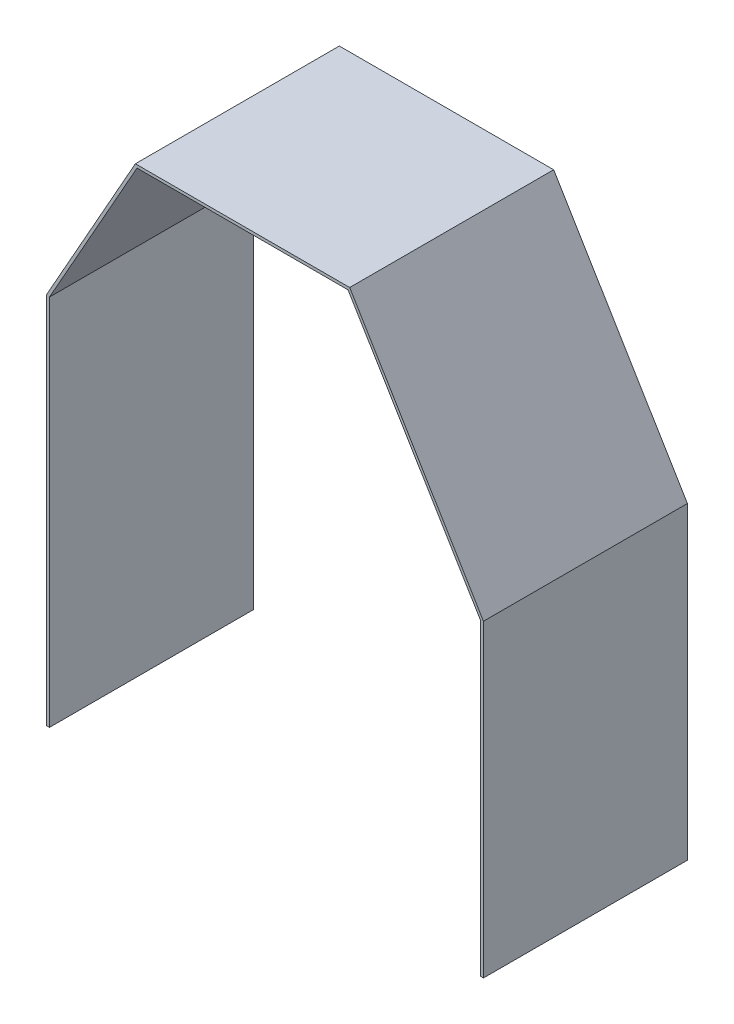
ISO-10303-21;
HEADER;
FILE_DESCRIPTION(('STEP AP214'),'2;1');
FILE_NAME('part.step','',(''),(''),'','','');
FILE_SCHEMA(('AUTOMOTIVE_DESIGN { 1 0 10303 214 1 1 1 1 }'));
ENDSEC;
DATA;
#1=APPLICATION_CONTEXT('core data for automotive mechanical design processes');
#2=APPLICATION_PROTOCOL_DEFINITION('international standard','automotive_design',2000,#1);
#3=PRODUCT_CONTEXT('',#1,'mechanical');
#4=PRODUCT('Part','Part','',(#3));
#5=PRODUCT_RELATED_PRODUCT_CATEGORY('part','',(#4));
#6=PRODUCT_DEFINITION_FORMATION('','',#4);
#7=PRODUCT_DEFINITION_CONTEXT('part definition',#1,'design');
#8=PRODUCT_DEFINITION('design','',#6,#7);
#9=PRODUCT_DEFINITION_SHAPE('','',#8);
#10=(LENGTH_UNIT() NAMED_UNIT(*) SI_UNIT(.MILLI.,.METRE.));
#11=(NAMED_UNIT(*) PLANE_ANGLE_UNIT() SI_UNIT($,.RADIAN.));
#12=(NAMED_UNIT(*) SI_UNIT($,.STERADIAN.) SOLID_ANGLE_UNIT());
#13=UNCERTAINTY_MEASURE_WITH_UNIT(LENGTH_MEASURE(1.E-05),#10,'distance_accuracy_value','');
#14=(GEOMETRIC_REPRESENTATION_CONTEXT(3) GLOBAL_UNCERTAINTY_ASSIGNED_CONTEXT((#13)) GLOBAL_UNIT_ASSIGNED_CONTEXT((#10,
#11,#12)) REPRESENTATION_CONTEXT('',''));
#15=CARTESIAN_POINT('',(0.,0.,0.));
#16=DIRECTION('',(0.,0.,1.));
#17=DIRECTION('',(1.,0.,0.));
#18=AXIS2_PLACEMENT_3D('',#15,#16,#17);
#19=CARTESIAN_POINT('',(-2.00000730477111,3.80536977384502E-06,-142.));
#20=DIRECTION('',(-1.,0.,0.));
#21=DIRECTION('',(0.,0.,1.));
#22=AXIS2_PLACEMENT_3D('',#19,#20,#21);
#23=PLANE('',#22);
#24=DIRECTION('',(0.,-1.,0.));
#25=VECTOR('',#24,1.);
#26=CARTESIAN_POINT('',(-2.00000730477111,3.80536977384502E-06,0.));
#27=LINE('',#26,#25);
#28=CARTESIAN_POINT('',(-2.00000730477111,260.000004065528,0.));
#29=VERTEX_POINT('',#28);
#30=CARTESIAN_POINT('',(-2.00000730477111,3.80536977384502E-06,0.));
#31=VERTEX_POINT('',#30);
#32=EDGE_CURVE('E151',#29,#31,#27,.T.);
#33=ORIENTED_EDGE('',*,*,#32,.F.);
#34=DIRECTION('',(0.,0.,1.));
#35=VECTOR('',#34,1.);
#36=CARTESIAN_POINT('',(-2.00000730477111,260.000004065528,-142.));
#37=LINE('',#36,#35);
#38=CARTESIAN_POINT('',(-2.00000730477111,260.000004065528,-142.));
#39=VERTEX_POINT('',#38);
#40=EDGE_CURVE('E11',#39,#29,#37,.T.);
#41=ORIENTED_EDGE('',*,*,#40,.F.);
#42=DIRECTION('',(0.,-1.,0.));
#43=VECTOR('',#42,1.);
#44=CARTESIAN_POINT('',(-2.00000730477111,3.80536977384502E-06,-142.));
#45=LINE('',#44,#43);
#46=CARTESIAN_POINT('',(-2.00000730477111,3.80536977384502E-06,-142.));
#47=VERTEX_POINT('',#46);
#48=EDGE_CURVE('E177',#39,#47,#45,.T.);
#49=ORIENTED_EDGE('',*,*,#48,.T.);
#50=DIRECTION('',(0.,0.,1.));
#51=VECTOR('',#50,1.);
#52=CARTESIAN_POINT('',(-2.00000730477111,3.80536977384502E-06,-142.));
#53=LINE('',#52,#51);
#54=EDGE_CURVE('E34',#47,#31,#53,.T.);
#55=ORIENTED_EDGE('',*,*,#54,.T.);
#56=EDGE_LOOP('',(#33,#41,#49,#55));
#57=FACE_BOUND('',#56,.T.);
#58=ADVANCED_FACE('F31',(#57),#23,.T.);
#59=CARTESIAN_POINT('',(59.8074747113915,369.746927632464,-142.));
#60=DIRECTION('',(-0.871321534689895,0.490712526012578,0.));
#61=DIRECTION('',(-0.490712526012578,-0.871321534689896,0.));
#62=AXIS2_PLACEMENT_3D('',#59,#60,#61);
#63=PLANE('',#62);
#64=DIRECTION('',(-0.490712526012578,-0.871321534689896,0.));
#65=VECTOR('',#64,1.);
#66=CARTESIAN_POINT('',(59.8074747113915,369.746927632464,0.));
#67=LINE('',#66,#65);
#68=CARTESIAN_POINT('',(59.8074747113915,369.746927632464,0.));
#69=VERTEX_POINT('',#68);
#70=EDGE_CURVE('E175',#69,#29,#67,.T.);
#71=ORIENTED_EDGE('',*,*,#70,.F.);
#72=DIRECTION('',(0.,0.,1.));
#73=VECTOR('',#72,1.);
#74=CARTESIAN_POINT('',(59.8074747113915,369.746927632464,-142.));
#75=LINE('',#74,#73);
#76=CARTESIAN_POINT('',(59.8074747113915,369.746927632464,-142.));
#77=VERTEX_POINT('',#76);
#78=EDGE_CURVE('E40',#77,#69,#75,.T.);
#79=ORIENTED_EDGE('',*,*,#78,.F.);
#80=DIRECTION('',(-0.490712526012578,-0.871321534689896,0.));
#81=VECTOR('',#80,1.);
#82=CARTESIAN_POINT('',(59.8074747113915,369.746927632464,-142.));
#83=LINE('',#82,#81);
#84=EDGE_CURVE('E141',#77,#39,#83,.T.);
#85=ORIENTED_EDGE('',*,*,#84,.T.);
#86=ORIENTED_EDGE('',*,*,#40,.T.);
#87=EDGE_LOOP('',(#71,#79,#85,#86));
#88=FACE_BOUND('',#87,.T.);
#89=ADVANCED_FACE('F206',(#88),#63,.T.);
#90=CARTESIAN_POINT('',(59.8074747113915,369.746927632464,-142.));
#91=DIRECTION('',(0.,1.,0.));
#92=DIRECTION('',(0.,0.,1.));
#93=AXIS2_PLACEMENT_3D('',#90,#91,#92);
#94=PLANE('',#93);
#95=DIRECTION('',(-1.,0.,0.));
#96=VECTOR('',#95,1.);
#97=CARTESIAN_POINT('',(59.8074747113915,369.746927632464,0.));
#98=LINE('',#97,#96);
#99=CARTESIAN_POINT('',(209.012375889982,369.746927632464,0.));
#100=VERTEX_POINT('',#99);
#101=EDGE_CURVE('E129',#100,#69,#98,.T.);
#102=ORIENTED_EDGE('',*,*,#101,.F.);
#103=DIRECTION('',(0.,0.,1.));
#104=VECTOR('',#103,1.);
#105=CARTESIAN_POINT('',(209.012375889982,369.746927632464,-142.));
#106=LINE('',#105,#104);
#107=CARTESIAN_POINT('',(209.012375889982,369.746927632464,-142.));
#108=VERTEX_POINT('',#107);
#109=EDGE_CURVE('E124',#108,#100,#106,.T.);
#110=ORIENTED_EDGE('',*,*,#109,.F.);
#111=DIRECTION('',(-1.,0.,0.));
#112=VECTOR('',#111,1.);
#113=CARTESIAN_POINT('',(59.8074747113915,369.746927632464,-142.));
#114=LINE('',#113,#112);
#115=EDGE_CURVE('E127',#108,#77,#114,.T.);
#116=ORIENTED_EDGE('',*,*,#115,.T.);
#117=ORIENTED_EDGE('',*,*,#78,.T.);
#118=EDGE_LOOP('',(#102,#110,#116,#117));
#119=FACE_BOUND('',#118,.T.);
#120=ADVANCED_FACE('F126',(#119),#94,.T.);
#121=CARTESIAN_POINT('',(209.012375889982,369.746927632464,-142.));
#122=DIRECTION('',(0.856694806511872,0.515823621498265,0.));
#123=DIRECTION('',(-0.515823621498265,0.856694806511873,0.));
#124=AXIS2_PLACEMENT_3D('',#121,#122,#123);
#125=PLANE('',#124);
#126=DIRECTION('',(-0.515823621498265,0.856694806511872,0.));
#127=VECTOR('',#126,1.);
#128=CARTESIAN_POINT('',(209.012375889982,369.746927632464,0.));
#129=LINE('',#128,#127);
#130=CARTESIAN_POINT('',(302.134985909321,215.08620050121,0.));
#131=VERTEX_POINT('',#130);
#132=EDGE_CURVE('E172',#131,#100,#129,.T.);
#133=ORIENTED_EDGE('',*,*,#132,.F.);
#134=DIRECTION('',(0.,0.,1.));
#135=VECTOR('',#134,1.);
#136=CARTESIAN_POINT('',(302.134985909321,215.08620050121,-142.));
#137=LINE('',#136,#135);
#138=CARTESIAN_POINT('',(302.134985909321,215.08620050121,-142.));
#139=VERTEX_POINT('',#138);
#140=EDGE_CURVE('E134',#139,#131,#137,.T.);
#141=ORIENTED_EDGE('',*,*,#140,.F.);
#142=DIRECTION('',(-0.515823621498265,0.856694806511872,0.));
#143=VECTOR('',#142,1.);
#144=CARTESIAN_POINT('',(209.012375889982,369.746927632464,-142.));
#145=LINE('',#144,#143);
#146=EDGE_CURVE('E139',#139,#108,#145,.T.);
#147=ORIENTED_EDGE('',*,*,#146,.T.);
#148=ORIENTED_EDGE('',*,*,#109,.T.);
#149=EDGE_LOOP('',(#133,#141,#147,#148));
#150=FACE_BOUND('',#149,.T.);
#151=ADVANCED_FACE('F143',(#150),#125,.T.);
#152=CARTESIAN_POINT('',(302.134985909321,-3.31530499667748E-07,-142.));
#153=DIRECTION('',(1.,0.,0.));
#154=DIRECTION('',(0.,0.,-1.));
#155=AXIS2_PLACEMENT_3D('',#152,#153,#154);
#156=PLANE('',#155);
#157=DIRECTION('',(0.,1.,0.));
#158=VECTOR('',#157,1.);
#159=CARTESIAN_POINT('',(302.134985909321,-3.31530499667748E-07,0.));
#160=LINE('',#159,#158);
#161=CARTESIAN_POINT('',(302.134985909321,-3.31530499667748E-07,0.));
#162=VERTEX_POINT('',#161);
#163=EDGE_CURVE('E169',#162,#131,#160,.T.);
#164=ORIENTED_EDGE('',*,*,#163,.F.);
#165=DIRECTION('',(0.,0.,1.));
#166=VECTOR('',#165,1.);
#167=CARTESIAN_POINT('',(302.134985909321,-3.31530499667748E-07,-142.));
#168=LINE('',#167,#166);
#169=CARTESIAN_POINT('',(302.134985909321,-3.31530499667748E-07,-142.));
#170=VERTEX_POINT('',#169);
#171=EDGE_CURVE('E181',#170,#162,#168,.T.);
#172=ORIENTED_EDGE('',*,*,#171,.F.);
#173=DIRECTION('',(0.,1.,0.));
#174=VECTOR('',#173,1.);
#175=CARTESIAN_POINT('',(302.134985909321,-3.31530499667748E-07,-142.));
#176=LINE('',#175,#174);
#177=EDGE_CURVE('E144',#170,#139,#176,.T.);
#178=ORIENTED_EDGE('',*,*,#177,.T.);
#179=ORIENTED_EDGE('',*,*,#140,.T.);
#180=EDGE_LOOP('',(#164,#172,#178,#179));
#181=FACE_BOUND('',#180,.T.);
#182=ADVANCED_FACE('F219',(#181),#156,.T.);
#183=CARTESIAN_POINT('',(302.134985909321,-3.31530499667748E-07,-142.));
#184=DIRECTION('',(0.,1.,0.));
#185=DIRECTION('',(0.,0.,1.));
#186=AXIS2_PLACEMENT_3D('',#183,#184,#185);
#187=PLANE('',#186);
#188=DIRECTION('',(-1.,0.,0.));
#189=VECTOR('',#188,1.);
#190=CARTESIAN_POINT('',(302.134985909321,-3.31530499667748E-07,0.));
#191=LINE('',#190,#189);
#192=CARTESIAN_POINT('',(300.134985909321,-3.31530499667748E-07,0.));
#193=VERTEX_POINT('',#192);
#194=EDGE_CURVE('E167',#162,#193,#191,.T.);
#195=ORIENTED_EDGE('',*,*,#194,.T.);
#196=DIRECTION('',(0.,0.,1.));
#197=VECTOR('',#196,1.);
#198=CARTESIAN_POINT('',(300.134985909321,-3.31530499667748E-07,-142.));
#199=LINE('',#198,#197);
#200=CARTESIAN_POINT('',(300.134985909321,-3.31530499667748E-07,-142.));
#201=VERTEX_POINT('',#200);
#202=EDGE_CURVE('E183',#201,#193,#199,.T.);
#203=ORIENTED_EDGE('',*,*,#202,.F.);
#204=DIRECTION('',(-1.,0.,0.));
#205=VECTOR('',#204,1.);
#206=CARTESIAN_POINT('',(302.134985909321,-3.31530499667748E-07,-142.));
#207=LINE('',#206,#205);
#208=EDGE_CURVE('E146',#170,#201,#207,.T.);
#209=ORIENTED_EDGE('',*,*,#208,.F.);
#210=ORIENTED_EDGE('',*,*,#171,.T.);
#211=EDGE_LOOP('',(#195,#203,#209,#210));
#212=FACE_BOUND('',#211,.T.);
#213=ADVANCED_FACE('F222',(#212),#187,.F.);
#214=CARTESIAN_POINT('',(300.134985909321,-3.31530499667748E-07,-142.));
#215=DIRECTION('',(1.,0.,0.));
#216=DIRECTION('',(0.,0.,-1.));
#217=AXIS2_PLACEMENT_3D('',#214,#215,#216);
#218=PLANE('',#217);
#219=DIRECTION('',(0.,1.,0.));
#220=VECTOR('',#219,1.);
#221=CARTESIAN_POINT('',(300.134985909321,-3.31530499667748E-07,0.));
#222=LINE('',#221,#220);
#223=CARTESIAN_POINT('',(300.134985909321,214.530564087849,0.));
#224=VERTEX_POINT('',#223);
#225=EDGE_CURVE('E165',#193,#224,#222,.T.);
#226=ORIENTED_EDGE('',*,*,#225,.T.);
#227=DIRECTION('',(0.,0.,1.));
#228=VECTOR('',#227,1.);
#229=CARTESIAN_POINT('',(300.134985909321,214.530564087849,-142.));
#230=LINE('',#229,#228);
#231=CARTESIAN_POINT('',(300.134985909321,214.530564087849,-142.));
#232=VERTEX_POINT('',#231);
#233=EDGE_CURVE('E186',#232,#224,#230,.T.);
#234=ORIENTED_EDGE('',*,*,#233,.F.);
#235=DIRECTION('',(0.,1.,0.));
#236=VECTOR('',#235,1.);
#237=CARTESIAN_POINT('',(300.134985909321,-3.31530499667748E-07,-142.));
#238=LINE('',#237,#236);
#239=EDGE_CURVE('E350',#201,#232,#238,.T.);
#240=ORIENTED_EDGE('',*,*,#239,.F.);
#241=ORIENTED_EDGE('',*,*,#202,.T.);
#242=EDGE_LOOP('',(#226,#234,#240,#241));
#243=FACE_BOUND('',#242,.T.);
#244=ADVANCED_FACE('F226',(#243),#218,.F.);
#245=CARTESIAN_POINT('',(207.298986276958,368.715280389468,-142.));
#246=DIRECTION('',(0.856694806511872,0.515823621498265,0.));
#247=DIRECTION('',(-0.515823621498265,0.856694806511873,0.));
#248=AXIS2_PLACEMENT_3D('',#245,#246,#247);
#249=PLANE('',#248);
#250=DIRECTION('',(-0.515823621498265,0.856694806511872,0.));
#251=VECTOR('',#250,1.);
#252=CARTESIAN_POINT('',(207.298986276958,368.715280389468,0.));
#253=LINE('',#252,#251);
#254=CARTESIAN_POINT('',(207.88204015123,367.746927632464,0.));
#255=VERTEX_POINT('',#254);
#256=EDGE_CURVE('E163',#224,#255,#253,.T.);
#257=ORIENTED_EDGE('',*,*,#256,.T.);
#258=DIRECTION('',(0.,0.,1.));
#259=VECTOR('',#258,1.);
#260=CARTESIAN_POINT('',(207.88204015123,367.746927632464,-142.));
#261=LINE('',#260,#259);
#262=CARTESIAN_POINT('',(207.88204015123,367.746927632464,-142.));
#263=VERTEX_POINT('',#262);
#264=EDGE_CURVE('E189',#263,#255,#261,.T.);
#265=ORIENTED_EDGE('',*,*,#264,.F.);
#266=DIRECTION('',(-0.515823621498265,0.856694806511872,0.));
#267=VECTOR('',#266,1.);
#268=CARTESIAN_POINT('',(207.298986276958,368.715280389468,-142.));
#269=LINE('',#268,#267);
#270=EDGE_CURVE('E343',#232,#263,#269,.T.);
#271=ORIENTED_EDGE('',*,*,#270,.F.);
#272=ORIENTED_EDGE('',*,*,#233,.T.);
#273=EDGE_LOOP('',(#257,#265,#271,#272));
#274=FACE_BOUND('',#273,.T.);
#275=ADVANCED_FACE('F230',(#274),#249,.F.);
#276=CARTESIAN_POINT('',(59.8074747113915,367.746927632464,-142.));
#277=DIRECTION('',(0.,1.,0.));
#278=DIRECTION('',(0.,0.,1.));
#279=AXIS2_PLACEMENT_3D('',#276,#277,#278);
#280=PLANE('',#279);
#281=DIRECTION('',(1.,0.,0.));
#282=VECTOR('',#281,1.);
#283=CARTESIAN_POINT('',(59.8074747113915,367.746927632464,0.));
#284=LINE('',#283,#282);
#285=CARTESIAN_POINT('',(60.9764747962308,367.746927632464,0.));
#286=VERTEX_POINT('',#285);
#287=EDGE_CURVE('E161',#255,#286,#284,.F.);
#288=ORIENTED_EDGE('',*,*,#287,.T.);
#289=DIRECTION('',(0.,0.,1.));
#290=VECTOR('',#289,1.);
#291=CARTESIAN_POINT('',(60.9764747962308,367.746927632464,-142.));
#292=LINE('',#291,#290);
#293=CARTESIAN_POINT('',(60.9764747962308,367.746927632464,-142.));
#294=VERTEX_POINT('',#293);
#295=EDGE_CURVE('E192',#294,#286,#292,.T.);
#296=ORIENTED_EDGE('',*,*,#295,.F.);
#297=DIRECTION('',(1.,0.,0.));
#298=VECTOR('',#297,1.);
#299=CARTESIAN_POINT('',(59.8074747113915,367.746927632464,-142.));
#300=LINE('',#299,#298);
#301=EDGE_CURVE('E340',#263,#294,#300,.F.);
#302=ORIENTED_EDGE('',*,*,#301,.F.);
#303=ORIENTED_EDGE('',*,*,#264,.T.);
#304=EDGE_LOOP('',(#288,#296,#302,#303));
#305=FACE_BOUND('',#304,.T.);
#306=ADVANCED_FACE('F234',(#305),#280,.F.);
#307=CARTESIAN_POINT('',(61.5501177807713,368.765502580439,-142.));
#308=DIRECTION('',(-0.871321534689895,0.490712526012578,0.));
#309=DIRECTION('',(-0.490712526012578,-0.871321534689896,0.));
#310=AXIS2_PLACEMENT_3D('',#307,#308,#309);
#311=PLANE('',#310);
#312=DIRECTION('',(-0.490712526012578,-0.871321534689896,0.));
#313=VECTOR('',#312,1.);
#314=CARTESIAN_POINT('',(61.5501177807713,368.765502580439,0.));
#315=LINE('',#314,#313);
#316=CARTESIAN_POINT('',(-7.30477110722459E-06,259.475548468864,0.));
#317=VERTEX_POINT('',#316);
#318=EDGE_CURVE('E159',#286,#317,#315,.T.);
#319=ORIENTED_EDGE('',*,*,#318,.T.);
#320=DIRECTION('',(0.,0.,1.));
#321=VECTOR('',#320,1.);
#322=CARTESIAN_POINT('',(-7.30477110722459E-06,259.475548468864,-142.));
#323=LINE('',#322,#321);
#324=CARTESIAN_POINT('',(-7.30477110722459E-06,259.475548468864,-142.));
#325=VERTEX_POINT('',#324);
#326=EDGE_CURVE('E195',#325,#317,#323,.T.);
#327=ORIENTED_EDGE('',*,*,#326,.F.);
#328=DIRECTION('',(-0.490712526012578,-0.871321534689896,0.));
#329=VECTOR('',#328,1.);
#330=CARTESIAN_POINT('',(61.5501177807713,368.765502580439,-142.));
#331=LINE('',#330,#329);
#332=EDGE_CURVE('E338',#294,#325,#331,.T.);
#333=ORIENTED_EDGE('',*,*,#332,.F.);
#334=ORIENTED_EDGE('',*,*,#295,.T.);
#335=EDGE_LOOP('',(#319,#327,#333,#334));
#336=FACE_BOUND('',#335,.T.);
#337=ADVANCED_FACE('F238',(#336),#311,.F.);
#338=CARTESIAN_POINT('',(-7.30477110700775E-06,3.80536977384502E-06,-142.));
#339=DIRECTION('',(-1.,0.,0.));
#340=DIRECTION('',(0.,0.,1.));
#341=AXIS2_PLACEMENT_3D('',#338,#339,#340);
#342=PLANE('',#341);
#343=DIRECTION('',(0.,1.,0.));
#344=VECTOR('',#343,1.);
#345=CARTESIAN_POINT('',(-7.30477110700775E-06,3.80536977384502E-06,0.));
#346=LINE('',#345,#344);
#347=CARTESIAN_POINT('',(-7.30477110700775E-06,3.80536977384502E-06,0.));
#348=VERTEX_POINT('',#347);
#349=EDGE_CURVE('E157',#317,#348,#346,.F.);
#350=ORIENTED_EDGE('',*,*,#349,.T.);
#351=DIRECTION('',(0.,0.,1.));
#352=VECTOR('',#351,1.);
#353=CARTESIAN_POINT('',(-7.30477110700775E-06,3.80536977384502E-06,-142.));
#354=LINE('',#353,#352);
#355=CARTESIAN_POINT('',(-7.30477110700775E-06,3.80536977384502E-06,-142.));
#356=VERTEX_POINT('',#355);
#357=EDGE_CURVE('E197',#356,#348,#354,.T.);
#358=ORIENTED_EDGE('',*,*,#357,.F.);
#359=DIRECTION('',(0.,1.,0.));
#360=VECTOR('',#359,1.);
#361=CARTESIAN_POINT('',(-7.30477110700775E-06,3.80536977384502E-06,-142.));
#362=LINE('',#361,#360);
#363=EDGE_CURVE('E357',#325,#356,#362,.F.);
#364=ORIENTED_EDGE('',*,*,#363,.F.);
#365=ORIENTED_EDGE('',*,*,#326,.T.);
#366=EDGE_LOOP('',(#350,#358,#364,#365));
#367=FACE_BOUND('',#366,.T.);
#368=ADVANCED_FACE('F242',(#367),#342,.F.);
#369=CARTESIAN_POINT('',(-7.30477110700775E-06,3.80536977384502E-06,-142.));
#370=DIRECTION('',(0.,1.,0.));
#371=DIRECTION('',(0.,0.,1.));
#372=AXIS2_PLACEMENT_3D('',#369,#370,#371);
#373=PLANE('',#372);
#374=DIRECTION('',(-1.,0.,0.));
#375=VECTOR('',#374,1.);
#376=CARTESIAN_POINT('',(-7.30477110700775E-06,3.80536977384502E-06,0.));
#377=LINE('',#376,#375);
#378=EDGE_CURVE('E154',#348,#31,#377,.T.);
#379=ORIENTED_EDGE('',*,*,#378,.T.);
#380=ORIENTED_EDGE('',*,*,#54,.F.);
#381=DIRECTION('',(-1.,0.,0.));
#382=VECTOR('',#381,1.);
#383=CARTESIAN_POINT('',(-7.30477110700775E-06,3.80536977384502E-06,-142.));
#384=LINE('',#383,#382);
#385=EDGE_CURVE('E99',#356,#47,#384,.T.);
#386=ORIENTED_EDGE('',*,*,#385,.F.);
#387=ORIENTED_EDGE('',*,*,#357,.T.);
#388=EDGE_LOOP('',(#379,#380,#386,#387));
#389=FACE_BOUND('',#388,.T.);
#390=ADVANCED_FACE('F202',(#389),#373,.F.);
#391=CARTESIAN_POINT('',(-2.00000730477111,3.80536977384502E-06,-142.));
#392=DIRECTION('',(0.,0.,-1.));
#393=DIRECTION('',(-1.,0.,0.));
#394=AXIS2_PLACEMENT_3D('',#391,#392,#393);
#395=PLANE('',#394);
#396=ORIENTED_EDGE('',*,*,#48,.F.);
#397=ORIENTED_EDGE('',*,*,#84,.F.);
#398=ORIENTED_EDGE('',*,*,#115,.F.);
#399=ORIENTED_EDGE('',*,*,#146,.F.);
#400=ORIENTED_EDGE('',*,*,#177,.F.);
#401=ORIENTED_EDGE('',*,*,#208,.T.);
#402=ORIENTED_EDGE('',*,*,#239,.T.);
#403=ORIENTED_EDGE('',*,*,#270,.T.);
#404=ORIENTED_EDGE('',*,*,#301,.T.);
#405=ORIENTED_EDGE('',*,*,#332,.T.);
#406=ORIENTED_EDGE('',*,*,#363,.T.);
#407=ORIENTED_EDGE('',*,*,#385,.T.);
#408=EDGE_LOOP('',(#396,#397,#398,#399,#400,#401,#402,#403,#404,#405,#406,#407));
#409=FACE_BOUND('',#408,.T.);
#410=ADVANCED_FACE('F137',(#409),#395,.T.);
#411=CARTESIAN_POINT('',(-2.00000730477111,3.80536977384502E-06,0.));
#412=DIRECTION('',(0.,0.,-1.));
#413=DIRECTION('',(-1.,0.,0.));
#414=AXIS2_PLACEMENT_3D('',#411,#412,#413);
#415=PLANE('',#414);
#416=ORIENTED_EDGE('',*,*,#32,.T.);
#417=ORIENTED_EDGE('',*,*,#378,.F.);
#418=ORIENTED_EDGE('',*,*,#349,.F.);
#419=ORIENTED_EDGE('',*,*,#318,.F.);
#420=ORIENTED_EDGE('',*,*,#287,.F.);
#421=ORIENTED_EDGE('',*,*,#256,.F.);
#422=ORIENTED_EDGE('',*,*,#225,.F.);
#423=ORIENTED_EDGE('',*,*,#194,.F.);
#424=ORIENTED_EDGE('',*,*,#163,.T.);
#425=ORIENTED_EDGE('',*,*,#132,.T.);
#426=ORIENTED_EDGE('',*,*,#101,.T.);
#427=ORIENTED_EDGE('',*,*,#70,.T.);
#428=EDGE_LOOP('',(#416,#417,#418,#419,#420,#421,#422,#423,#424,#425,#426,#427));
#429=FACE_BOUND('',#428,.T.);
#430=ADVANCED_FACE('F205',(#429),#415,.F.);
#431=CLOSED_SHELL('',(#58,#89,#120,#151,#182,#213,#244,#275,#306,#337,#368,#390,#410,#430));
#432=MANIFOLD_SOLID_BREP('B2',#431);
#433=ADVANCED_BREP_SHAPE_REPRESENTATION('',(#18,#432),#14);
#434=SHAPE_DEFINITION_REPRESENTATION(#9,#433);
ENDSEC;
END-ISO-10303-21;
